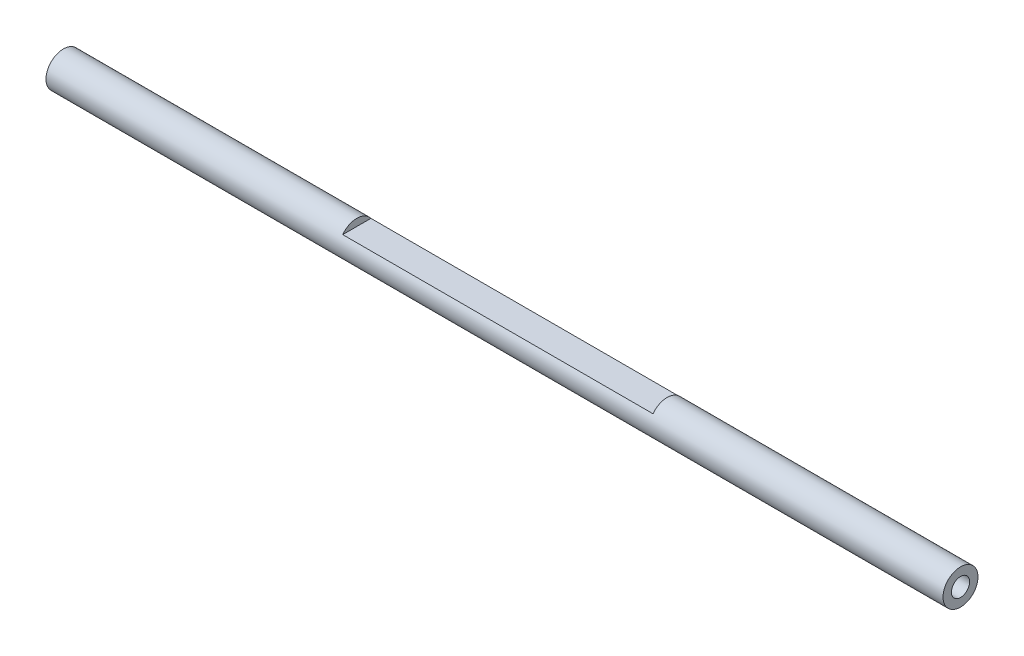
ISO-10303-21;
HEADER;
FILE_DESCRIPTION(('STEP AP214'),'2;1');
FILE_NAME('part.step','',(''),(''),'','','');
FILE_SCHEMA(('AUTOMOTIVE_DESIGN { 1 0 10303 214 1 1 1 1 }'));
ENDSEC;
DATA;
#1=APPLICATION_CONTEXT('core data for automotive mechanical design processes');
#2=APPLICATION_PROTOCOL_DEFINITION('international standard','automotive_design',2000,#1);
#3=PRODUCT_CONTEXT('',#1,'mechanical');
#4=PRODUCT('Part','Part','',(#3));
#5=PRODUCT_RELATED_PRODUCT_CATEGORY('part','',(#4));
#6=PRODUCT_DEFINITION_FORMATION('','',#4);
#7=PRODUCT_DEFINITION_CONTEXT('part definition',#1,'design');
#8=PRODUCT_DEFINITION('design','',#6,#7);
#9=PRODUCT_DEFINITION_SHAPE('','',#8);
#10=(LENGTH_UNIT() NAMED_UNIT(*) SI_UNIT(.MILLI.,.METRE.));
#11=(NAMED_UNIT(*) PLANE_ANGLE_UNIT() SI_UNIT($,.RADIAN.));
#12=(NAMED_UNIT(*) SI_UNIT($,.STERADIAN.) SOLID_ANGLE_UNIT());
#13=UNCERTAINTY_MEASURE_WITH_UNIT(LENGTH_MEASURE(1.E-05),#10,'distance_accuracy_value','');
#14=(GEOMETRIC_REPRESENTATION_CONTEXT(3) GLOBAL_UNCERTAINTY_ASSIGNED_CONTEXT((#13)) GLOBAL_UNIT_ASSIGNED_CONTEXT((#10,
#11,#12)) REPRESENTATION_CONTEXT('',''));
#15=CARTESIAN_POINT('',(0.,0.,0.));
#16=DIRECTION('',(0.,0.,1.));
#17=DIRECTION('',(1.,0.,0.));
#18=AXIS2_PLACEMENT_3D('',#15,#16,#17);
#19=CARTESIAN_POINT('',(-216.8,0.,0.));
#20=DIRECTION('',(-1.,0.,0.));
#21=DIRECTION('',(0.,0.,-1.));
#22=AXIS2_PLACEMENT_3D('',#19,#20,#21);
#23=PLANE('',#22);
#24=CARTESIAN_POINT('',(-216.8,0.,0.));
#25=DIRECTION('',(-1.,0.,0.));
#26=DIRECTION('',(0.,0.,1.));
#27=AXIS2_PLACEMENT_3D('',#24,#25,#26);
#28=CIRCLE('',#27,4.4);
#29=CARTESIAN_POINT('',(-216.8,0.,4.4));
#30=VERTEX_POINT('',#29);
#31=EDGE_CURVE('E100',#30,#30,#28,.T.);
#32=ORIENTED_EDGE('',*,*,#31,.F.);
#33=EDGE_LOOP('',(#32));
#34=FACE_BOUND('',#33,.T.);
#35=CARTESIAN_POINT('',(-216.8,0.,0.));
#36=DIRECTION('',(1.,0.,0.));
#37=DIRECTION('',(0.,0.,-1.));
#38=AXIS2_PLACEMENT_3D('',#35,#36,#37);
#39=CIRCLE('',#38,8.45);
#40=CARTESIAN_POINT('',(-216.8,0.,-8.45));
#41=VERTEX_POINT('',#40);
#42=EDGE_CURVE('E94',#41,#41,#39,.T.);
#43=ORIENTED_EDGE('',*,*,#42,.F.);
#44=EDGE_LOOP('',(#43));
#45=FACE_BOUND('',#44,.T.);
#46=ADVANCED_FACE('F39',(#34,#45),#23,.T.);
#47=CARTESIAN_POINT('',(-186.8,0.,0.));
#48=DIRECTION('',(-1.,0.,0.));
#49=DIRECTION('',(0.,0.,1.));
#50=AXIS2_PLACEMENT_3D('',#47,#48,#49);
#51=CONICAL_SURFACE('',#50,4.39999999999999,1.02974425867665);
#52=CARTESIAN_POINT('',(-184.156213276279,0.,0.));
#53=VERTEX_POINT('',#52);
#54=VERTEX_LOOP('',#53);
#55=FACE_BOUND('',#54,.T.);
#56=CARTESIAN_POINT('',(-186.8,0.,0.));
#57=DIRECTION('',(-1.,0.,0.));
#58=DIRECTION('',(0.,0.,1.));
#59=AXIS2_PLACEMENT_3D('',#56,#57,#58);
#60=CIRCLE('',#59,4.39999999999999);
#61=CARTESIAN_POINT('',(-186.8,0.,4.39999999999999));
#62=VERTEX_POINT('',#61);
#63=EDGE_CURVE('E97',#62,#62,#60,.T.);
#64=ORIENTED_EDGE('',*,*,#63,.T.);
#65=EDGE_LOOP('',(#64));
#66=FACE_BOUND('',#65,.T.);
#67=ADVANCED_FACE('F109',(#55,#66),#51,.F.);
#68=CARTESIAN_POINT('',(-216.8,0.,0.));
#69=DIRECTION('',(-1.,0.,0.));
#70=DIRECTION('',(0.,0.,1.));
#71=AXIS2_PLACEMENT_3D('',#68,#69,#70);
#72=CYLINDRICAL_SURFACE('',#71,4.4);
#73=ORIENTED_EDGE('',*,*,#63,.F.);
#74=EDGE_LOOP('',(#73));
#75=FACE_BOUND('',#74,.T.);
#76=ORIENTED_EDGE('',*,*,#31,.T.);
#77=EDGE_LOOP('',(#76));
#78=FACE_BOUND('',#77,.T.);
#79=ADVANCED_FACE('F105',(#75,#78),#72,.F.);
#80=CARTESIAN_POINT('',(186.8,0.,0.));
#81=DIRECTION('',(1.,0.,0.));
#82=DIRECTION('',(0.,0.,-1.));
#83=AXIS2_PLACEMENT_3D('',#80,#81,#82);
#84=CONICAL_SURFACE('',#83,4.39999999999999,1.02974425867665);
#85=CARTESIAN_POINT('',(184.156213276279,0.,0.));
#86=VERTEX_POINT('',#85);
#87=VERTEX_LOOP('',#86);
#88=FACE_BOUND('',#87,.T.);
#89=CARTESIAN_POINT('',(186.8,0.,0.));
#90=DIRECTION('',(1.,0.,0.));
#91=DIRECTION('',(0.,0.,-1.));
#92=AXIS2_PLACEMENT_3D('',#89,#90,#91);
#93=CIRCLE('',#92,4.39999999999999);
#94=CARTESIAN_POINT('',(186.8,0.,-4.39999999999999));
#95=VERTEX_POINT('',#94);
#96=EDGE_CURVE('E88',#95,#95,#93,.T.);
#97=ORIENTED_EDGE('',*,*,#96,.T.);
#98=EDGE_LOOP('',(#97));
#99=FACE_BOUND('',#98,.T.);
#100=ADVANCED_FACE('F126',(#88,#99),#84,.F.);
#101=CARTESIAN_POINT('',(216.8,0.,0.));
#102=DIRECTION('',(1.,0.,0.));
#103=DIRECTION('',(0.,0.,-1.));
#104=AXIS2_PLACEMENT_3D('',#101,#102,#103);
#105=CYLINDRICAL_SURFACE('',#104,4.4);
#106=ORIENTED_EDGE('',*,*,#96,.F.);
#107=EDGE_LOOP('',(#106));
#108=FACE_BOUND('',#107,.T.);
#109=CARTESIAN_POINT('',(216.8,0.,0.));
#110=DIRECTION('',(1.,0.,0.));
#111=DIRECTION('',(0.,0.,-1.));
#112=AXIS2_PLACEMENT_3D('',#109,#110,#111);
#113=CIRCLE('',#112,4.4);
#114=CARTESIAN_POINT('',(216.8,0.,-4.4));
#115=VERTEX_POINT('',#114);
#116=EDGE_CURVE('E91',#115,#115,#113,.T.);
#117=ORIENTED_EDGE('',*,*,#116,.T.);
#118=EDGE_LOOP('',(#117));
#119=FACE_BOUND('',#118,.T.);
#120=ADVANCED_FACE('F121',(#108,#119),#105,.F.);
#121=CARTESIAN_POINT('',(216.8,0.,0.));
#122=DIRECTION('',(1.,0.,0.));
#123=DIRECTION('',(0.,0.,-1.));
#124=AXIS2_PLACEMENT_3D('',#121,#122,#123);
#125=PLANE('',#124);
#126=ORIENTED_EDGE('',*,*,#116,.F.);
#127=EDGE_LOOP('',(#126));
#128=FACE_BOUND('',#127,.T.);
#129=CARTESIAN_POINT('',(216.8,0.,0.));
#130=DIRECTION('',(1.,0.,0.));
#131=DIRECTION('',(0.,0.,-1.));
#132=AXIS2_PLACEMENT_3D('',#129,#130,#131);
#133=CIRCLE('',#132,8.45);
#134=CARTESIAN_POINT('',(216.8,0.,-8.45));
#135=VERTEX_POINT('',#134);
#136=EDGE_CURVE('E78',#135,#135,#133,.T.);
#137=ORIENTED_EDGE('',*,*,#136,.T.);
#138=EDGE_LOOP('',(#137));
#139=FACE_BOUND('',#138,.T.);
#140=ADVANCED_FACE('F114',(#128,#139),#125,.T.);
#141=CARTESIAN_POINT('',(216.8,0.,0.));
#142=DIRECTION('',(-1.,0.,0.));
#143=DIRECTION('',(0.,0.,1.));
#144=AXIS2_PLACEMENT_3D('',#141,#142,#143);
#145=CYLINDRICAL_SURFACE('',#144,8.45);
#146=CARTESIAN_POINT('',(75.,0.,0.));
#147=DIRECTION('',(-1.,0.,0.));
#148=DIRECTION('',(0.,0.,1.));
#149=AXIS2_PLACEMENT_3D('',#146,#147,#148);
#150=CIRCLE('',#149,8.45);
#151=CARTESIAN_POINT('',(75.,5.,6.81193805021743));
#152=VERTEX_POINT('',#151);
#153=CARTESIAN_POINT('',(75.,5.,-6.81193805021743));
#154=VERTEX_POINT('',#153);
#155=EDGE_CURVE('E77',#152,#154,#150,.T.);
#156=ORIENTED_EDGE('',*,*,#155,.F.);
#157=DIRECTION('',(-1.,0.,0.));
#158=VECTOR('',#157,1.);
#159=CARTESIAN_POINT('',(216.8,5.,6.81193805021743));
#160=LINE('',#159,#158);
#161=CARTESIAN_POINT('',(-75.,5.,6.81193805021743));
#162=VERTEX_POINT('',#161);
#163=EDGE_CURVE('E12',#152,#162,#160,.T.);
#164=ORIENTED_EDGE('',*,*,#163,.T.);
#165=CARTESIAN_POINT('',(-75.,0.,0.));
#166=DIRECTION('',(1.,0.,0.));
#167=DIRECTION('',(0.,0.,-1.));
#168=AXIS2_PLACEMENT_3D('',#165,#166,#167);
#169=CIRCLE('',#168,8.45);
#170=CARTESIAN_POINT('',(-75.,5.,-6.81193805021743));
#171=VERTEX_POINT('',#170);
#172=EDGE_CURVE('E47',#171,#162,#169,.T.);
#173=ORIENTED_EDGE('',*,*,#172,.F.);
#174=DIRECTION('',(-1.,0.,0.));
#175=VECTOR('',#174,1.);
#176=CARTESIAN_POINT('',(216.8,5.,-6.81193805021743));
#177=LINE('',#176,#175);
#178=EDGE_CURVE('E70',#171,#154,#177,.F.);
#179=ORIENTED_EDGE('',*,*,#178,.T.);
#180=EDGE_LOOP('',(#156,#164,#173,#179));
#181=FACE_BOUND('',#180,.T.);
#182=ORIENTED_EDGE('',*,*,#136,.F.);
#183=EDGE_LOOP('',(#182));
#184=FACE_BOUND('',#183,.T.);
#185=ORIENTED_EDGE('',*,*,#42,.T.);
#186=EDGE_LOOP('',(#185));
#187=FACE_BOUND('',#186,.T.);
#188=ADVANCED_FACE('F41',(#181,#184,#187),#145,.T.);
#189=CARTESIAN_POINT('',(-75.,15.,-20.));
#190=DIRECTION('',(1.,0.,0.));
#191=DIRECTION('',(0.,0.,-1.));
#192=AXIS2_PLACEMENT_3D('',#189,#190,#191);
#193=PLANE('',#192);
#194=ORIENTED_EDGE('',*,*,#172,.T.);
#195=DIRECTION('',(0.,0.,1.));
#196=VECTOR('',#195,1.);
#197=CARTESIAN_POINT('',(-75.,5.,-20.));
#198=LINE('',#197,#196);
#199=EDGE_CURVE('E73',#171,#162,#198,.T.);
#200=ORIENTED_EDGE('',*,*,#199,.F.);
#201=EDGE_LOOP('',(#194,#200));
#202=FACE_BOUND('',#201,.T.);
#203=ADVANCED_FACE('F81',(#202),#193,.T.);
#204=CARTESIAN_POINT('',(75.,15.,-20.));
#205=DIRECTION('',(-1.,0.,0.));
#206=DIRECTION('',(0.,0.,1.));
#207=AXIS2_PLACEMENT_3D('',#204,#205,#206);
#208=PLANE('',#207);
#209=ORIENTED_EDGE('',*,*,#155,.T.);
#210=DIRECTION('',(0.,0.,-1.));
#211=VECTOR('',#210,1.);
#212=CARTESIAN_POINT('',(75.,5.,-20.));
#213=LINE('',#212,#211);
#214=EDGE_CURVE('E54',#152,#154,#213,.T.);
#215=ORIENTED_EDGE('',*,*,#214,.F.);
#216=EDGE_LOOP('',(#209,#215));
#217=FACE_BOUND('',#216,.T.);
#218=ADVANCED_FACE('F119',(#217),#208,.T.);
#219=CARTESIAN_POINT('',(0.,5.,0.));
#220=DIRECTION('',(0.,-1.,0.));
#221=DIRECTION('',(0.,0.,-1.));
#222=AXIS2_PLACEMENT_3D('',#219,#220,#221);
#223=PLANE('',#222);
#224=ORIENTED_EDGE('',*,*,#214,.T.);
#225=ORIENTED_EDGE('',*,*,#178,.F.);
#226=ORIENTED_EDGE('',*,*,#199,.T.);
#227=ORIENTED_EDGE('',*,*,#163,.F.);
#228=EDGE_LOOP('',(#224,#225,#226,#227));
#229=FACE_BOUND('',#228,.T.);
#230=ADVANCED_FACE('F72',(#229),#223,.F.);
#231=CLOSED_SHELL('',(#46,#67,#79,#100,#120,#140,#188,#203,#218,#230));
#232=MANIFOLD_SOLID_BREP('B2',#231);
#233=ADVANCED_BREP_SHAPE_REPRESENTATION('',(#18,#232),#14);
#234=SHAPE_DEFINITION_REPRESENTATION(#9,#233);
ENDSEC;
END-ISO-10303-21;
